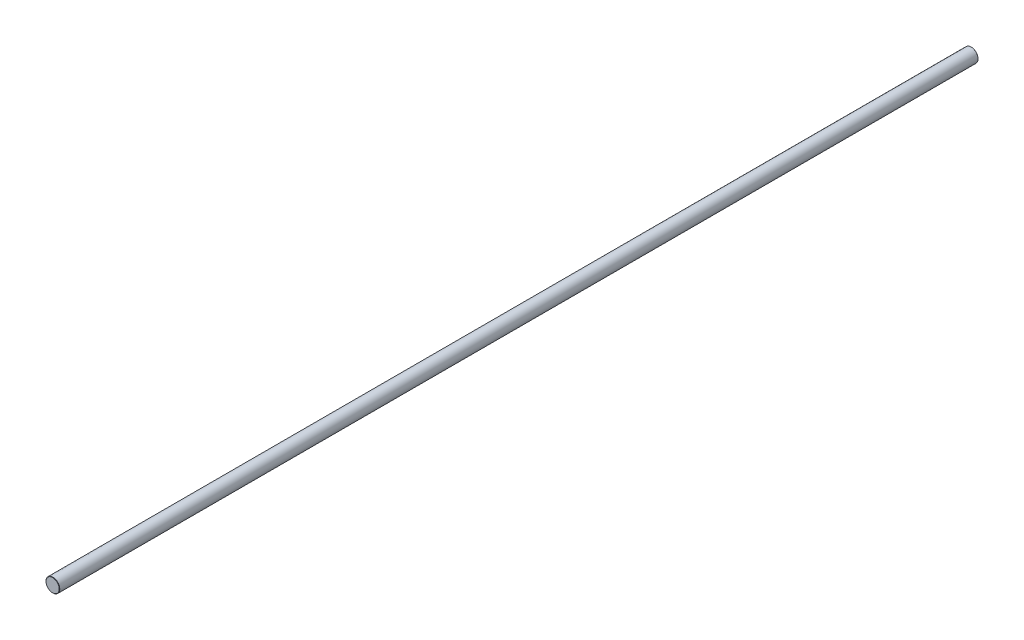
ISO-10303-21;
HEADER;
FILE_DESCRIPTION(('STEP AP214'),'2;1');
FILE_NAME('part.step','',(''),(''),'','','');
FILE_SCHEMA(('AUTOMOTIVE_DESIGN { 1 0 10303 214 1 1 1 1 }'));
ENDSEC;
DATA;
#1=APPLICATION_CONTEXT('core data for automotive mechanical design processes');
#2=APPLICATION_PROTOCOL_DEFINITION('international standard','automotive_design',2000,#1);
#3=PRODUCT_CONTEXT('',#1,'mechanical');
#4=PRODUCT('Part','Part','',(#3));
#5=PRODUCT_RELATED_PRODUCT_CATEGORY('part','',(#4));
#6=PRODUCT_DEFINITION_FORMATION('','',#4);
#7=PRODUCT_DEFINITION_CONTEXT('part definition',#1,'design');
#8=PRODUCT_DEFINITION('design','',#6,#7);
#9=PRODUCT_DEFINITION_SHAPE('','',#8);
#10=(LENGTH_UNIT() NAMED_UNIT(*) SI_UNIT(.MILLI.,.METRE.));
#11=(NAMED_UNIT(*) PLANE_ANGLE_UNIT() SI_UNIT($,.RADIAN.));
#12=(NAMED_UNIT(*) SI_UNIT($,.STERADIAN.) SOLID_ANGLE_UNIT());
#13=UNCERTAINTY_MEASURE_WITH_UNIT(LENGTH_MEASURE(1.E-05),#10,'distance_accuracy_value','');
#14=(GEOMETRIC_REPRESENTATION_CONTEXT(3) GLOBAL_UNCERTAINTY_ASSIGNED_CONTEXT((#13)) GLOBAL_UNIT_ASSIGNED_CONTEXT((#10,
#11,#12)) REPRESENTATION_CONTEXT('',''));
#15=CARTESIAN_POINT('',(0.,0.,0.));
#16=DIRECTION('',(0.,0.,1.));
#17=DIRECTION('',(1.,0.,0.));
#18=AXIS2_PLACEMENT_3D('',#15,#16,#17);
#19=CARTESIAN_POINT('',(0.,0.,200.));
#20=DIRECTION('',(0.,0.,-1.));
#21=DIRECTION('',(-1.,0.,0.));
#22=AXIS2_PLACEMENT_3D('',#19,#20,#21);
#23=CYLINDRICAL_SURFACE('',#22,3.);
#24=CARTESIAN_POINT('',(0.,0.,-199.88));
#25=DIRECTION('',(0.,0.,1.));
#26=DIRECTION('',(1.,0.,0.));
#27=AXIS2_PLACEMENT_3D('',#24,#25,#26);
#28=CIRCLE('',#27,3.);
#29=CARTESIAN_POINT('',(3.,0.,-199.88));
#30=VERTEX_POINT('',#29);
#31=EDGE_CURVE('E50',#30,#30,#28,.T.);
#32=ORIENTED_EDGE('',*,*,#31,.T.);
#33=EDGE_LOOP('',(#32));
#34=FACE_BOUND('',#33,.T.);
#35=CARTESIAN_POINT('',(0.,0.,199.88));
#36=DIRECTION('',(0.,0.,1.));
#37=DIRECTION('',(1.,0.,0.));
#38=AXIS2_PLACEMENT_3D('',#35,#36,#37);
#39=CIRCLE('',#38,3.);
#40=CARTESIAN_POINT('',(3.,0.,199.88));
#41=VERTEX_POINT('',#40);
#42=EDGE_CURVE('E54',#41,#41,#39,.F.);
#43=ORIENTED_EDGE('',*,*,#42,.T.);
#44=EDGE_LOOP('',(#43));
#45=FACE_BOUND('',#44,.T.);
#46=ADVANCED_FACE('F39',(#34,#45),#23,.T.);
#47=CARTESIAN_POINT('',(0.,0.,200.));
#48=DIRECTION('',(0.,0.,1.));
#49=DIRECTION('',(1.,0.,0.));
#50=AXIS2_PLACEMENT_3D('',#47,#48,#49);
#51=PLANE('',#50);
#52=CARTESIAN_POINT('',(0.,0.,200.));
#53=DIRECTION('',(0.,0.,1.));
#54=DIRECTION('',(1.,0.,0.));
#55=AXIS2_PLACEMENT_3D('',#52,#53,#54);
#56=CIRCLE('',#55,2.87999999999999);
#57=CARTESIAN_POINT('',(2.87999999999999,0.,200.));
#58=VERTEX_POINT('',#57);
#59=EDGE_CURVE('E10',#58,#58,#56,.T.);
#60=ORIENTED_EDGE('',*,*,#59,.T.);
#61=EDGE_LOOP('',(#60));
#62=FACE_BOUND('',#61,.T.);
#63=ADVANCED_FACE('F70',(#62),#51,.T.);
#64=CARTESIAN_POINT('',(0.,0.,-200.));
#65=DIRECTION('',(0.,0.,1.));
#66=DIRECTION('',(1.,0.,0.));
#67=AXIS2_PLACEMENT_3D('',#64,#65,#66);
#68=PLANE('',#67);
#69=CARTESIAN_POINT('',(0.,0.,-200.));
#70=DIRECTION('',(0.,0.,1.));
#71=DIRECTION('',(1.,0.,0.));
#72=AXIS2_PLACEMENT_3D('',#69,#70,#71);
#73=CIRCLE('',#72,2.88000000000005);
#74=CARTESIAN_POINT('',(2.88000000000005,0.,-200.));
#75=VERTEX_POINT('',#74);
#76=EDGE_CURVE('E46',#75,#75,#73,.F.);
#77=ORIENTED_EDGE('',*,*,#76,.T.);
#78=EDGE_LOOP('',(#77));
#79=FACE_BOUND('',#78,.T.);
#80=ADVANCED_FACE('F67',(#79),#68,.F.);
#81=CARTESIAN_POINT('',(0.,0.,-199.88));
#82=DIRECTION('',(0.,0.,1.));
#83=DIRECTION('',(1.,0.,0.));
#84=AXIS2_PLACEMENT_3D('',#81,#82,#83);
#85=CONICAL_SURFACE('',#84,3.,0.785398163397439);
#86=ORIENTED_EDGE('',*,*,#76,.F.);
#87=EDGE_LOOP('',(#86));
#88=FACE_BOUND('',#87,.T.);
#89=ORIENTED_EDGE('',*,*,#31,.F.);
#90=EDGE_LOOP('',(#89));
#91=FACE_BOUND('',#90,.T.);
#92=ADVANCED_FACE('F63',(#88,#91),#85,.T.);
#93=CARTESIAN_POINT('',(0.,0.,200.));
#94=DIRECTION('',(0.,0.,-1.));
#95=DIRECTION('',(-1.,0.,0.));
#96=AXIS2_PLACEMENT_3D('',#93,#94,#95);
#97=CONICAL_SURFACE('',#96,2.87999999999999,0.785398163397439);
#98=ORIENTED_EDGE('',*,*,#42,.F.);
#99=EDGE_LOOP('',(#98));
#100=FACE_BOUND('',#99,.T.);
#101=ORIENTED_EDGE('',*,*,#59,.F.);
#102=EDGE_LOOP('',(#101));
#103=FACE_BOUND('',#102,.T.);
#104=ADVANCED_FACE('F41',(#100,#103),#97,.T.);
#105=CLOSED_SHELL('',(#46,#63,#80,#92,#104));
#106=MANIFOLD_SOLID_BREP('B2',#105);
#107=ADVANCED_BREP_SHAPE_REPRESENTATION('',(#18,#106),#14);
#108=SHAPE_DEFINITION_REPRESENTATION(#9,#107);
ENDSEC;
END-ISO-10303-21;
